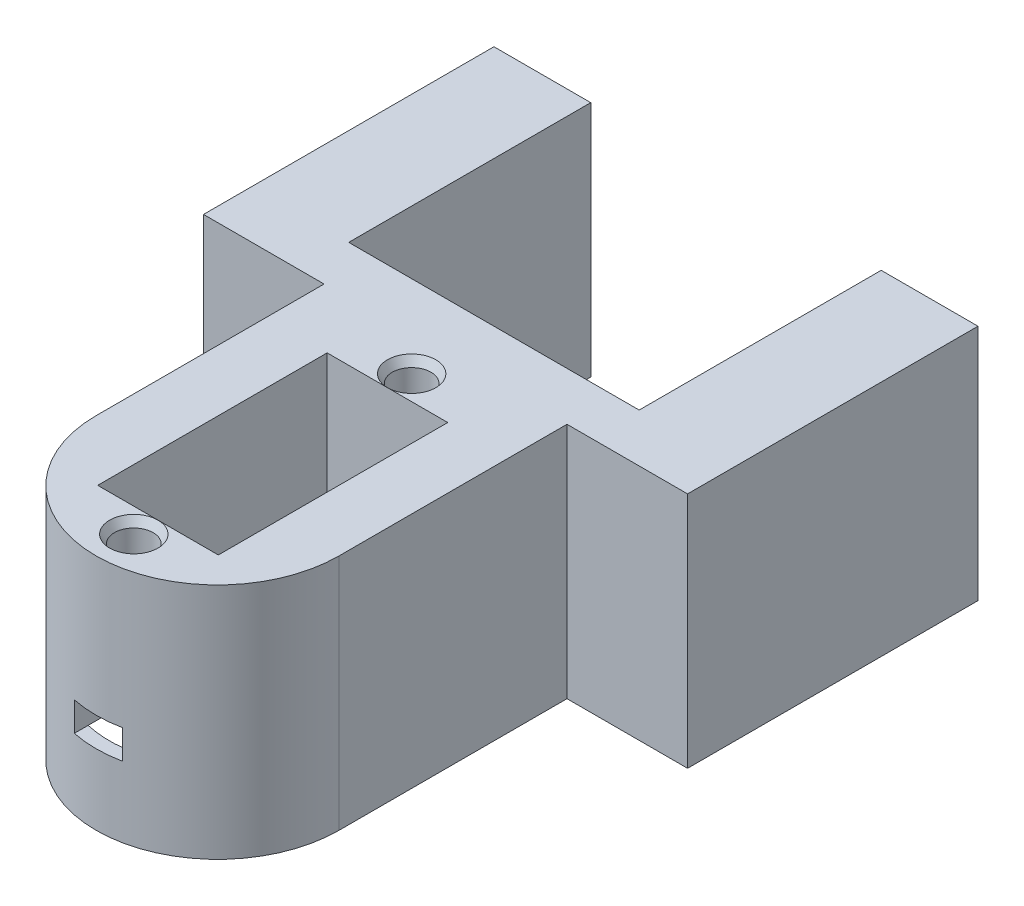
ISO-10303-21;
HEADER;
FILE_DESCRIPTION(('STEP AP214'),'2;1');
FILE_NAME('part.step','',(''),(''),'','','');
FILE_SCHEMA(('AUTOMOTIVE_DESIGN { 1 0 10303 214 1 1 1 1 }'));
ENDSEC;
DATA;
#1=APPLICATION_CONTEXT('core data for automotive mechanical design processes');
#2=APPLICATION_PROTOCOL_DEFINITION('international standard','automotive_design',2000,#1);
#3=PRODUCT_CONTEXT('',#1,'mechanical');
#4=PRODUCT('Part','Part','',(#3));
#5=PRODUCT_RELATED_PRODUCT_CATEGORY('part','',(#4));
#6=PRODUCT_DEFINITION_FORMATION('','',#4);
#7=PRODUCT_DEFINITION_CONTEXT('part definition',#1,'design');
#8=PRODUCT_DEFINITION('design','',#6,#7);
#9=PRODUCT_DEFINITION_SHAPE('','',#8);
#10=(LENGTH_UNIT() NAMED_UNIT(*) SI_UNIT(.MILLI.,.METRE.));
#11=(NAMED_UNIT(*) PLANE_ANGLE_UNIT() SI_UNIT($,.RADIAN.));
#12=(NAMED_UNIT(*) SI_UNIT($,.STERADIAN.) SOLID_ANGLE_UNIT());
#13=UNCERTAINTY_MEASURE_WITH_UNIT(LENGTH_MEASURE(1.E-05),#10,'distance_accuracy_value','');
#14=(GEOMETRIC_REPRESENTATION_CONTEXT(3) GLOBAL_UNCERTAINTY_ASSIGNED_CONTEXT((#13)) GLOBAL_UNIT_ASSIGNED_CONTEXT((#10,
#11,#12)) REPRESENTATION_CONTEXT('',''));
#15=CARTESIAN_POINT('',(0.,0.,0.));
#16=DIRECTION('',(0.,0.,1.));
#17=DIRECTION('',(1.,0.,0.));
#18=AXIS2_PLACEMENT_3D('',#15,#16,#17);
#19=CARTESIAN_POINT('',(-6.23,55.2500254806121,6.));
#20=DIRECTION('',(0.,1.,0.));
#21=DIRECTION('',(0.,0.,1.));
#22=AXIS2_PLACEMENT_3D('',#19,#20,#21);
#23=PLANE('',#22);
#24=DIRECTION('',(0.,0.,1.));
#25=VECTOR('',#24,1.);
#26=CARTESIAN_POINT('',(2.5,55.2500254806121,-0.001000000000001));
#27=LINE('',#26,#25);
#28=CARTESIAN_POINT('',(2.5,55.2500254806121,29.7));
#29=VERTEX_POINT('',#28);
#30=CARTESIAN_POINT('',(2.5,55.2500254806121,34.4161170617659));
#31=VERTEX_POINT('',#30);
#32=EDGE_CURVE('E300',#29,#31,#27,.T.);
#33=ORIENTED_EDGE('',*,*,#32,.F.);
#34=DIRECTION('',(1.,0.,0.));
#35=VECTOR('',#34,1.);
#36=CARTESIAN_POINT('',(-6.23,55.2500254806121,29.7));
#37=LINE('',#36,#35);
#38=CARTESIAN_POINT('',(6.23,55.2500254806121,29.7));
#39=VERTEX_POINT('',#38);
#40=EDGE_CURVE('E326',#29,#39,#37,.T.);
#41=ORIENTED_EDGE('',*,*,#40,.T.);
#42=DIRECTION('',(0.,0.,-1.));
#43=VECTOR('',#42,1.);
#44=CARTESIAN_POINT('',(6.23,55.2500254806121,29.7));
#45=LINE('',#44,#43);
#46=CARTESIAN_POINT('',(6.23,55.2500254806121,14.3028599015696));
#47=VERTEX_POINT('',#46);
#48=EDGE_CURVE('E321',#39,#47,#45,.T.);
#49=ORIENTED_EDGE('',*,*,#48,.T.);
#50=CARTESIAN_POINT('',(0.,55.2500254806121,23.55));
#51=DIRECTION('',(0.,1.,0.));
#52=DIRECTION('',(0.,0.,1.));
#53=AXIS2_PLACEMENT_3D('',#50,#51,#52);
#54=CIRCLE('',#53,11.15);
#55=EDGE_CURVE('E313',#31,#47,#54,.T.);
#56=ORIENTED_EDGE('',*,*,#55,.F.);
#57=EDGE_LOOP('',(#33,#41,#49,#56));
#58=FACE_BOUND('',#57,.T.);
#59=ADVANCED_FACE('F41',(#58),#23,.F.);
#60=CARTESIAN_POINT('',(-6.23,11.2879454134343,29.7));
#61=DIRECTION('',(0.,0.,-1.));
#62=DIRECTION('',(-1.,0.,0.));
#63=AXIS2_PLACEMENT_3D('',#60,#61,#62);
#64=PLANE('',#63);
#65=DIRECTION('',(-1.,0.,0.));
#66=VECTOR('',#65,1.);
#67=CARTESIAN_POINT('',(-2.5,58.2500254806121,29.7));
#68=LINE('',#67,#66);
#69=CARTESIAN_POINT('',(2.5,58.2500254806121,29.7));
#70=VERTEX_POINT('',#69);
#71=CARTESIAN_POINT('',(-2.5,58.2500254806121,29.7));
#72=VERTEX_POINT('',#71);
#73=EDGE_CURVE('E282',#70,#72,#68,.T.);
#74=ORIENTED_EDGE('',*,*,#73,.T.);
#75=DIRECTION('',(0.,-1.,0.));
#76=VECTOR('',#75,1.);
#77=CARTESIAN_POINT('',(-2.5,58.2500254806121,29.7));
#78=LINE('',#77,#76);
#79=CARTESIAN_POINT('',(-2.5,55.2500254806121,29.7));
#80=VERTEX_POINT('',#79);
#81=EDGE_CURVE('E290',#72,#80,#78,.T.);
#82=ORIENTED_EDGE('',*,*,#81,.T.);
#83=CARTESIAN_POINT('',(-6.23,55.2500254806121,29.7));
#84=VERTEX_POINT('',#83);
#85=EDGE_CURVE('E356',#84,#80,#37,.T.);
#86=ORIENTED_EDGE('',*,*,#85,.F.);
#87=DIRECTION('',(0.,1.,0.));
#88=VECTOR('',#87,1.);
#89=CARTESIAN_POINT('',(-6.23,11.2879454134343,29.7));
#90=LINE('',#89,#88);
#91=CARTESIAN_POINT('',(-6.23,72.5000254806121,29.7));
#92=VERTEX_POINT('',#91);
#93=EDGE_CURVE('E355',#84,#92,#90,.T.);
#94=ORIENTED_EDGE('',*,*,#93,.T.);
#95=DIRECTION('',(-1.,0.,0.));
#96=VECTOR('',#95,1.);
#97=CARTESIAN_POINT('',(-6.23,72.5000254806121,29.7));
#98=LINE('',#97,#96);
#99=CARTESIAN_POINT('',(0.,72.5000254806121,29.7));
#100=VERTEX_POINT('',#99);
#101=EDGE_CURVE('E328',#100,#92,#98,.T.);
#102=ORIENTED_EDGE('',*,*,#101,.F.);
#103=CARTESIAN_POINT('',(6.23,72.5000254806121,29.7));
#104=VERTEX_POINT('',#103);
#105=EDGE_CURVE('E327',#104,#100,#98,.T.);
#106=ORIENTED_EDGE('',*,*,#105,.F.);
#107=DIRECTION('',(0.,1.,0.));
#108=VECTOR('',#107,1.);
#109=CARTESIAN_POINT('',(6.23,11.2879454134343,29.7));
#110=LINE('',#109,#108);
#111=EDGE_CURVE('E341',#39,#104,#110,.T.);
#112=ORIENTED_EDGE('',*,*,#111,.F.);
#113=ORIENTED_EDGE('',*,*,#40,.F.);
#114=DIRECTION('',(0.,1.,0.));
#115=VECTOR('',#114,1.);
#116=CARTESIAN_POINT('',(2.5,58.2500254806121,29.7));
#117=LINE('',#116,#115);
#118=EDGE_CURVE('E281',#29,#70,#117,.T.);
#119=ORIENTED_EDGE('',*,*,#118,.T.);
#120=EDGE_LOOP('',(#74,#82,#86,#94,#102,#106,#112,#113,#119));
#121=FACE_BOUND('',#120,.T.);
#122=ADVANCED_FACE('F405',(#121),#64,.T.);
#123=CARTESIAN_POINT('',(-6.23,72.5000254806121,6.));
#124=DIRECTION('',(0.,-1.,0.));
#125=DIRECTION('',(0.,0.,-1.));
#126=AXIS2_PLACEMENT_3D('',#123,#124,#125);
#127=PLANE('',#126);
#128=DIRECTION('',(0.,0.,1.));
#129=VECTOR('',#128,1.);
#130=CARTESIAN_POINT('',(-12.5467811820916,72.5000254806121,23.55));
#131=LINE('',#130,#129);
#132=CARTESIAN_POINT('',(-12.5467811820916,72.5000254806121,0.));
#133=VERTEX_POINT('',#132);
#134=CARTESIAN_POINT('',(-12.5467811820916,72.5000254806121,23.55));
#135=VERTEX_POINT('',#134);
#136=EDGE_CURVE('E332',#133,#135,#131,.T.);
#137=ORIENTED_EDGE('',*,*,#136,.T.);
#138=CARTESIAN_POINT('',(0.,72.5000254806121,23.55));
#139=DIRECTION('',(0.,1.,0.));
#140=DIRECTION('',(0.,0.,1.));
#141=AXIS2_PLACEMENT_3D('',#138,#139,#140);
#142=CIRCLE('',#141,12.5467811820916);
#143=CARTESIAN_POINT('',(12.5467811820916,72.5000254806121,23.55));
#144=VERTEX_POINT('',#143);
#145=EDGE_CURVE('E336',#135,#144,#142,.T.);
#146=ORIENTED_EDGE('',*,*,#145,.T.);
#147=DIRECTION('',(0.,0.,-1.));
#148=VECTOR('',#147,1.);
#149=CARTESIAN_POINT('',(12.5467811820916,72.5000254806121,23.55));
#150=LINE('',#149,#148);
#151=CARTESIAN_POINT('',(12.5467811820916,72.5000254806121,0.));
#152=VERTEX_POINT('',#151);
#153=EDGE_CURVE('E342',#144,#152,#150,.T.);
#154=ORIENTED_EDGE('',*,*,#153,.T.);
#155=DIRECTION('',(1.,0.,0.));
#156=VECTOR('',#155,1.);
#157=CARTESIAN_POINT('',(-25.,72.5000254806121,0.));
#158=LINE('',#157,#156);
#159=CARTESIAN_POINT('',(25.,72.5000254806121,0.));
#160=VERTEX_POINT('',#159);
#161=EDGE_CURVE('E488',#152,#160,#158,.T.);
#162=ORIENTED_EDGE('',*,*,#161,.T.);
#163=DIRECTION('',(0.,0.,-1.));
#164=VECTOR('',#163,1.);
#165=CARTESIAN_POINT('',(25.,72.5000254806121,-30.));
#166=LINE('',#165,#164);
#167=CARTESIAN_POINT('',(25.,72.5000254806121,-30.));
#168=VERTEX_POINT('',#167);
#169=EDGE_CURVE('E490',#160,#168,#166,.T.);
#170=ORIENTED_EDGE('',*,*,#169,.T.);
#171=DIRECTION('',(-1.,0.,0.));
#172=VECTOR('',#171,1.);
#173=CARTESIAN_POINT('',(15.,72.5000254806121,-30.));
#174=LINE('',#173,#172);
#175=CARTESIAN_POINT('',(15.,72.5000254806121,-30.));
#176=VERTEX_POINT('',#175);
#177=EDGE_CURVE('E220',#168,#176,#174,.T.);
#178=ORIENTED_EDGE('',*,*,#177,.T.);
#179=DIRECTION('',(0.,0.,1.));
#180=VECTOR('',#179,1.);
#181=CARTESIAN_POINT('',(15.,72.5000254806121,-5.));
#182=LINE('',#181,#180);
#183=CARTESIAN_POINT('',(15.,72.5000254806121,-5.));
#184=VERTEX_POINT('',#183);
#185=EDGE_CURVE('E489',#176,#184,#182,.T.);
#186=ORIENTED_EDGE('',*,*,#185,.T.);
#187=DIRECTION('',(-1.,0.,0.));
#188=VECTOR('',#187,1.);
#189=CARTESIAN_POINT('',(-15.,72.5000254806121,-5.));
#190=LINE('',#189,#188);
#191=CARTESIAN_POINT('',(-15.,72.5000254806121,-5.));
#192=VERTEX_POINT('',#191);
#193=EDGE_CURVE('E492',#184,#192,#190,.T.);
#194=ORIENTED_EDGE('',*,*,#193,.T.);
#195=DIRECTION('',(0.,0.,-1.));
#196=VECTOR('',#195,1.);
#197=CARTESIAN_POINT('',(-15.,72.5000254806121,-30.));
#198=LINE('',#197,#196);
#199=CARTESIAN_POINT('',(-15.,72.5000254806121,-30.));
#200=VERTEX_POINT('',#199);
#201=EDGE_CURVE('E498',#192,#200,#198,.T.);
#202=ORIENTED_EDGE('',*,*,#201,.T.);
#203=DIRECTION('',(-1.,0.,0.));
#204=VECTOR('',#203,1.);
#205=CARTESIAN_POINT('',(-25.,72.5000254806121,-30.));
#206=LINE('',#205,#204);
#207=CARTESIAN_POINT('',(-25.,72.5000254806121,-30.));
#208=VERTEX_POINT('',#207);
#209=EDGE_CURVE('E230',#200,#208,#206,.T.);
#210=ORIENTED_EDGE('',*,*,#209,.T.);
#211=DIRECTION('',(0.,0.,1.));
#212=VECTOR('',#211,1.);
#213=CARTESIAN_POINT('',(-25.,72.5000254806121,0.));
#214=LINE('',#213,#212);
#215=CARTESIAN_POINT('',(-25.,72.5000254806121,0.));
#216=VERTEX_POINT('',#215);
#217=EDGE_CURVE('E228',#208,#216,#214,.T.);
#218=ORIENTED_EDGE('',*,*,#217,.T.);
#219=EDGE_CURVE('E231',#216,#133,#158,.T.);
#220=ORIENTED_EDGE('',*,*,#219,.T.);
#221=EDGE_LOOP('',(#137,#146,#154,#162,#170,#178,#186,#194,#202,#210,#218,#220));
#222=FACE_BOUND('',#221,.T.);
#223=DIRECTION('',(0.,0.,-1.));
#224=VECTOR('',#223,1.);
#225=CARTESIAN_POINT('',(-6.23,72.5000254806121,0.));
#226=LINE('',#225,#224);
#227=CARTESIAN_POINT('',(-6.23,72.5000254806121,6.));
#228=VERTEX_POINT('',#227);
#229=EDGE_CURVE('E335',#92,#228,#226,.T.);
#230=ORIENTED_EDGE('',*,*,#229,.T.);
#231=DIRECTION('',(-1.,0.,0.));
#232=VECTOR('',#231,1.);
#233=CARTESIAN_POINT('',(-6.23,72.5000254806121,6.));
#234=LINE('',#233,#232);
#235=CARTESIAN_POINT('',(0.,72.5000254806121,6.));
#236=VERTEX_POINT('',#235);
#237=EDGE_CURVE('E369',#236,#228,#234,.T.);
#238=ORIENTED_EDGE('',*,*,#237,.F.);
#239=CARTESIAN_POINT('',(0.,72.5000254806121,3.5));
#240=DIRECTION('',(0.,-1.,0.));
#241=DIRECTION('',(0.,0.,-1.));
#242=AXIS2_PLACEMENT_3D('',#239,#240,#241);
#243=CIRCLE('',#242,2.49999999999999);
#244=EDGE_CURVE('E380',#236,#236,#243,.T.);
#245=ORIENTED_EDGE('',*,*,#244,.T.);
#246=CARTESIAN_POINT('',(6.23,72.5000254806121,6.));
#247=VERTEX_POINT('',#246);
#248=EDGE_CURVE('E371',#247,#236,#234,.T.);
#249=ORIENTED_EDGE('',*,*,#248,.F.);
#250=DIRECTION('',(0.,0.,1.));
#251=VECTOR('',#250,1.);
#252=CARTESIAN_POINT('',(6.23,72.5000254806121,29.7));
#253=LINE('',#252,#251);
#254=EDGE_CURVE('E319',#247,#104,#253,.T.);
#255=ORIENTED_EDGE('',*,*,#254,.T.);
#256=ORIENTED_EDGE('',*,*,#105,.T.);
#257=CARTESIAN_POINT('',(0.,72.5000254806121,32.2));
#258=DIRECTION('',(0.,-1.,0.));
#259=DIRECTION('',(0.,0.,-1.));
#260=AXIS2_PLACEMENT_3D('',#257,#258,#259);
#261=CIRCLE('',#260,2.5);
#262=EDGE_CURVE('E379',#100,#100,#261,.T.);
#263=ORIENTED_EDGE('',*,*,#262,.T.);
#264=ORIENTED_EDGE('',*,*,#101,.T.);
#265=EDGE_LOOP('',(#230,#238,#245,#249,#255,#256,#263,#264));
#266=FACE_BOUND('',#265,.T.);
#267=ADVANCED_FACE('F406',(#222,#266),#127,.F.);
#268=CARTESIAN_POINT('',(0.,11.2879454134343,23.55));
#269=DIRECTION('',(0.,1.,0.));
#270=DIRECTION('',(0.,0.,1.));
#271=AXIS2_PLACEMENT_3D('',#268,#269,#270);
#272=CYLINDRICAL_SURFACE('',#271,12.5467811820916);
#273=CARTESIAN_POINT('',(0.,47.9500254806121,23.55));
#274=DIRECTION('',(0.,-1.,0.));
#275=DIRECTION('',(0.,0.,-1.));
#276=AXIS2_PLACEMENT_3D('',#273,#274,#275);
#277=CIRCLE('',#276,12.5467811820916);
#278=CARTESIAN_POINT('',(12.5467811820916,47.9500254806121,23.55));
#279=VERTEX_POINT('',#278);
#280=CARTESIAN_POINT('',(-12.5467811820916,47.9500254806121,23.55));
#281=VERTEX_POINT('',#280);
#282=EDGE_CURVE('E315',#279,#281,#277,.T.);
#283=ORIENTED_EDGE('',*,*,#282,.F.);
#284=DIRECTION('',(0.,1.,0.));
#285=VECTOR('',#284,1.);
#286=CARTESIAN_POINT('',(12.5467811820916,11.2879454134343,23.55));
#287=LINE('',#286,#285);
#288=EDGE_CURVE('E346',#279,#144,#287,.T.);
#289=ORIENTED_EDGE('',*,*,#288,.T.);
#290=ORIENTED_EDGE('',*,*,#145,.F.);
#291=DIRECTION('',(0.,1.,0.));
#292=VECTOR('',#291,1.);
#293=CARTESIAN_POINT('',(-12.5467811820916,11.2879454134343,23.55));
#294=LINE('',#293,#292);
#295=EDGE_CURVE('E60',#281,#135,#294,.T.);
#296=ORIENTED_EDGE('',*,*,#295,.F.);
#297=EDGE_LOOP('',(#283,#289,#290,#296));
#298=FACE_BOUND('',#297,.T.);
#299=CARTESIAN_POINT('',(0.,55.2500254806121,23.55));
#300=DIRECTION('',(0.,-1.,0.));
#301=DIRECTION('',(0.,0.,-1.));
#302=AXIS2_PLACEMENT_3D('',#299,#300,#301);
#303=CIRCLE('',#302,12.5467811820916);
#304=CARTESIAN_POINT('',(2.5,55.2500254806121,35.8451908497302));
#305=VERTEX_POINT('',#304);
#306=CARTESIAN_POINT('',(-2.5,55.2500254806121,35.8451908497302));
#307=VERTEX_POINT('',#306);
#308=EDGE_CURVE('E272',#305,#307,#303,.T.);
#309=ORIENTED_EDGE('',*,*,#308,.T.);
#310=DIRECTION('',(0.,1.,0.));
#311=VECTOR('',#310,1.);
#312=CARTESIAN_POINT('',(-2.5,11.2879454134343,35.8451908497302));
#313=LINE('',#312,#311);
#314=CARTESIAN_POINT('',(-2.5,58.2500254806121,35.8451908497302));
#315=VERTEX_POINT('',#314);
#316=EDGE_CURVE('E273',#307,#315,#313,.T.);
#317=ORIENTED_EDGE('',*,*,#316,.T.);
#318=CARTESIAN_POINT('',(0.,58.2500254806121,23.55));
#319=DIRECTION('',(0.,1.,0.));
#320=DIRECTION('',(0.,0.,1.));
#321=AXIS2_PLACEMENT_3D('',#318,#319,#320);
#322=CIRCLE('',#321,12.5467811820916);
#323=CARTESIAN_POINT('',(2.5,58.2500254806121,35.8451908497302));
#324=VERTEX_POINT('',#323);
#325=EDGE_CURVE('E270',#315,#324,#322,.T.);
#326=ORIENTED_EDGE('',*,*,#325,.T.);
#327=DIRECTION('',(0.,1.,0.));
#328=VECTOR('',#327,1.);
#329=CARTESIAN_POINT('',(2.5,11.2879454134343,35.8451908497302));
#330=LINE('',#329,#328);
#331=EDGE_CURVE('E274',#324,#305,#330,.F.);
#332=ORIENTED_EDGE('',*,*,#331,.T.);
#333=EDGE_LOOP('',(#309,#317,#326,#332));
#334=FACE_BOUND('',#333,.T.);
#335=ADVANCED_FACE('F428',(#298,#334),#272,.T.);
#336=CARTESIAN_POINT('',(0.,107.987681704295,23.55));
#337=DIRECTION('',(0.,-1.,0.));
#338=DIRECTION('',(0.,0.,-1.));
#339=AXIS2_PLACEMENT_3D('',#336,#337,#338);
#340=CYLINDRICAL_SURFACE('',#339,11.15);
#341=CARTESIAN_POINT('',(0.,47.9500254806121,23.55));
#342=DIRECTION('',(0.,-1.,0.));
#343=DIRECTION('',(0.,0.,-1.));
#344=AXIS2_PLACEMENT_3D('',#341,#342,#343);
#345=CIRCLE('',#344,11.15);
#346=CARTESIAN_POINT('',(0.,47.9500254806121,12.4));
#347=VERTEX_POINT('',#346);
#348=EDGE_CURVE('E310',#347,#347,#345,.T.);
#349=ORIENTED_EDGE('',*,*,#348,.T.);
#350=EDGE_LOOP('',(#349));
#351=FACE_BOUND('',#350,.T.);
#352=CARTESIAN_POINT('',(0.,55.2500254806121,23.55));
#353=DIRECTION('',(0.,1.,0.));
#354=DIRECTION('',(0.,0.,1.));
#355=AXIS2_PLACEMENT_3D('',#352,#353,#354);
#356=CIRCLE('',#355,11.15);
#357=CARTESIAN_POINT('',(-6.23,55.2500254806121,14.3028599015696));
#358=VERTEX_POINT('',#357);
#359=EDGE_CURVE('E11',#358,#47,#356,.F.);
#360=ORIENTED_EDGE('',*,*,#359,.F.);
#361=CARTESIAN_POINT('',(-2.5,55.2500254806121,34.4161170617659));
#362=VERTEX_POINT('',#361);
#363=EDGE_CURVE('E314',#358,#362,#54,.T.);
#364=ORIENTED_EDGE('',*,*,#363,.T.);
#365=EDGE_CURVE('E316',#362,#31,#54,.T.);
#366=ORIENTED_EDGE('',*,*,#365,.T.);
#367=ORIENTED_EDGE('',*,*,#55,.T.);
#368=EDGE_LOOP('',(#360,#364,#366,#367));
#369=FACE_BOUND('',#368,.T.);
#370=ADVANCED_FACE('F419',(#351,#369),#340,.F.);
#371=ORIENTED_EDGE('',*,*,#85,.T.);
#372=DIRECTION('',(0.,0.,1.));
#373=VECTOR('',#372,1.);
#374=CARTESIAN_POINT('',(-2.5,55.2500254806121,-0.001000000000001));
#375=LINE('',#374,#373);
#376=EDGE_CURVE('E301',#80,#362,#375,.T.);
#377=ORIENTED_EDGE('',*,*,#376,.T.);
#378=ORIENTED_EDGE('',*,*,#363,.F.);
#379=DIRECTION('',(0.,0.,1.));
#380=VECTOR('',#379,1.);
#381=CARTESIAN_POINT('',(-6.23,55.2500254806121,0.));
#382=LINE('',#381,#380);
#383=EDGE_CURVE('E325',#358,#84,#382,.T.);
#384=ORIENTED_EDGE('',*,*,#383,.T.);
#385=EDGE_LOOP('',(#371,#377,#378,#384));
#386=FACE_BOUND('',#385,.T.);
#387=ADVANCED_FACE('F403',(#386),#23,.F.);
#388=CARTESIAN_POINT('',(0.,0.,6.));
#389=DIRECTION('',(0.,0.,-1.));
#390=DIRECTION('',(-1.,0.,0.));
#391=AXIS2_PLACEMENT_3D('',#388,#389,#390);
#392=PLANE('',#391);
#393=DIRECTION('',(0.,-1.,0.));
#394=VECTOR('',#393,1.);
#395=CARTESIAN_POINT('',(-6.23,55.2500254806121,6.));
#396=LINE('',#395,#394);
#397=CARTESIAN_POINT('',(-6.23,55.2500254806121,6.));
#398=VERTEX_POINT('',#397);
#399=EDGE_CURVE('E363',#228,#398,#396,.T.);
#400=ORIENTED_EDGE('',*,*,#399,.T.);
#401=DIRECTION('',(1.,0.,0.));
#402=VECTOR('',#401,1.);
#403=CARTESIAN_POINT('',(-6.23,55.2500254806121,6.));
#404=LINE('',#403,#402);
#405=CARTESIAN_POINT('',(6.23,55.2500254806121,6.));
#406=VERTEX_POINT('',#405);
#407=EDGE_CURVE('E364',#398,#406,#404,.T.);
#408=ORIENTED_EDGE('',*,*,#407,.T.);
#409=DIRECTION('',(0.,1.,0.));
#410=VECTOR('',#409,1.);
#411=CARTESIAN_POINT('',(6.23,55.2500254806121,6.));
#412=LINE('',#411,#410);
#413=EDGE_CURVE('E370',#406,#247,#412,.T.);
#414=ORIENTED_EDGE('',*,*,#413,.T.);
#415=ORIENTED_EDGE('',*,*,#248,.T.);
#416=ORIENTED_EDGE('',*,*,#237,.T.);
#417=EDGE_LOOP('',(#400,#408,#414,#415,#416));
#418=FACE_BOUND('',#417,.T.);
#419=ADVANCED_FACE('F412',(#418),#392,.F.);
#420=CARTESIAN_POINT('',(-6.23,11.2879454134343,0.));
#421=DIRECTION('',(1.,0.,0.));
#422=DIRECTION('',(0.,0.,-1.));
#423=AXIS2_PLACEMENT_3D('',#420,#421,#422);
#424=PLANE('',#423);
#425=ORIENTED_EDGE('',*,*,#399,.F.);
#426=ORIENTED_EDGE('',*,*,#229,.F.);
#427=ORIENTED_EDGE('',*,*,#93,.F.);
#428=ORIENTED_EDGE('',*,*,#383,.F.);
#429=EDGE_CURVE('E318',#398,#358,#382,.T.);
#430=ORIENTED_EDGE('',*,*,#429,.F.);
#431=EDGE_LOOP('',(#425,#426,#427,#428,#430));
#432=FACE_BOUND('',#431,.T.);
#433=ADVANCED_FACE('F421',(#432),#424,.T.);
#434=CARTESIAN_POINT('',(6.23,11.2879454134343,29.7));
#435=DIRECTION('',(-1.,0.,0.));
#436=DIRECTION('',(0.,0.,1.));
#437=AXIS2_PLACEMENT_3D('',#434,#435,#436);
#438=PLANE('',#437);
#439=EDGE_CURVE('E324',#47,#406,#45,.T.);
#440=ORIENTED_EDGE('',*,*,#439,.F.);
#441=ORIENTED_EDGE('',*,*,#48,.F.);
#442=ORIENTED_EDGE('',*,*,#111,.T.);
#443=ORIENTED_EDGE('',*,*,#254,.F.);
#444=ORIENTED_EDGE('',*,*,#413,.F.);
#445=EDGE_LOOP('',(#440,#441,#442,#443,#444));
#446=FACE_BOUND('',#445,.T.);
#447=ADVANCED_FACE('F448',(#446),#438,.T.);
#448=CARTESIAN_POINT('',(12.5467811820916,11.2879454134343,23.55));
#449=DIRECTION('',(1.,0.,0.));
#450=DIRECTION('',(0.,0.,-1.));
#451=AXIS2_PLACEMENT_3D('',#448,#449,#450);
#452=PLANE('',#451);
#453=ORIENTED_EDGE('',*,*,#288,.F.);
#454=DIRECTION('',(0.,0.,1.));
#455=VECTOR('',#454,1.);
#456=CARTESIAN_POINT('',(12.5467811820916,47.9500254806121,0.));
#457=LINE('',#456,#455);
#458=CARTESIAN_POINT('',(12.5467811820916,47.9500254806121,0.));
#459=VERTEX_POINT('',#458);
#460=EDGE_CURVE('E262',#459,#279,#457,.T.);
#461=ORIENTED_EDGE('',*,*,#460,.F.);
#462=DIRECTION('',(0.,1.,0.));
#463=VECTOR('',#462,1.);
#464=CARTESIAN_POINT('',(12.5467811820916,11.2879454134343,0.));
#465=LINE('',#464,#463);
#466=EDGE_CURVE('E343',#459,#152,#465,.T.);
#467=ORIENTED_EDGE('',*,*,#466,.T.);
#468=ORIENTED_EDGE('',*,*,#153,.F.);
#469=EDGE_LOOP('',(#453,#461,#467,#468));
#470=FACE_BOUND('',#469,.T.);
#471=ADVANCED_FACE('F465',(#470),#452,.T.);
#472=CARTESIAN_POINT('',(-12.5467811820916,11.2879454134343,23.55));
#473=DIRECTION('',(-1.,0.,0.));
#474=DIRECTION('',(0.,0.,1.));
#475=AXIS2_PLACEMENT_3D('',#472,#473,#474);
#476=PLANE('',#475);
#477=DIRECTION('',(0.,1.,0.));
#478=VECTOR('',#477,1.);
#479=CARTESIAN_POINT('',(-12.5467811820916,11.2879454134343,0.));
#480=LINE('',#479,#478);
#481=CARTESIAN_POINT('',(-12.5467811820916,47.9500254806121,0.));
#482=VERTEX_POINT('',#481);
#483=EDGE_CURVE('E347',#482,#133,#480,.T.);
#484=ORIENTED_EDGE('',*,*,#483,.F.);
#485=DIRECTION('',(0.,0.,-1.));
#486=VECTOR('',#485,1.);
#487=CARTESIAN_POINT('',(-12.5467811820916,47.9500254806121,23.55));
#488=LINE('',#487,#486);
#489=EDGE_CURVE('E263',#281,#482,#488,.T.);
#490=ORIENTED_EDGE('',*,*,#489,.F.);
#491=ORIENTED_EDGE('',*,*,#295,.T.);
#492=ORIENTED_EDGE('',*,*,#136,.F.);
#493=EDGE_LOOP('',(#484,#490,#491,#492));
#494=FACE_BOUND('',#493,.T.);
#495=ADVANCED_FACE('F467',(#494),#476,.T.);
#496=CARTESIAN_POINT('',(0.,47.9500254806121,23.55));
#497=DIRECTION('',(0.,-1.,0.));
#498=DIRECTION('',(0.,0.,-1.));
#499=AXIS2_PLACEMENT_3D('',#496,#497,#498);
#500=PLANE('',#499);
#501=ORIENTED_EDGE('',*,*,#282,.T.);
#502=ORIENTED_EDGE('',*,*,#489,.T.);
#503=DIRECTION('',(1.,0.,0.));
#504=VECTOR('',#503,1.);
#505=CARTESIAN_POINT('',(-25.,47.9500254806121,0.));
#506=LINE('',#505,#504);
#507=CARTESIAN_POINT('',(-25.,47.9500254806121,0.));
#508=VERTEX_POINT('',#507);
#509=EDGE_CURVE('E232',#508,#482,#506,.T.);
#510=ORIENTED_EDGE('',*,*,#509,.F.);
#511=DIRECTION('',(0.,0.,1.));
#512=VECTOR('',#511,1.);
#513=CARTESIAN_POINT('',(-25.,47.9500254806121,0.));
#514=LINE('',#513,#512);
#515=CARTESIAN_POINT('',(-25.,47.9500254806121,-30.));
#516=VERTEX_POINT('',#515);
#517=EDGE_CURVE('E237',#516,#508,#514,.T.);
#518=ORIENTED_EDGE('',*,*,#517,.F.);
#519=DIRECTION('',(-1.,0.,0.));
#520=VECTOR('',#519,1.);
#521=CARTESIAN_POINT('',(-25.,47.9500254806121,-30.));
#522=LINE('',#521,#520);
#523=CARTESIAN_POINT('',(-15.,47.9500254806121,-30.));
#524=VERTEX_POINT('',#523);
#525=EDGE_CURVE('E242',#524,#516,#522,.T.);
#526=ORIENTED_EDGE('',*,*,#525,.F.);
#527=DIRECTION('',(0.,0.,-1.));
#528=VECTOR('',#527,1.);
#529=CARTESIAN_POINT('',(-15.,47.9500254806121,-30.));
#530=LINE('',#529,#528);
#531=CARTESIAN_POINT('',(-15.,47.9500254806121,-5.));
#532=VERTEX_POINT('',#531);
#533=EDGE_CURVE('E247',#532,#524,#530,.T.);
#534=ORIENTED_EDGE('',*,*,#533,.F.);
#535=DIRECTION('',(-1.,0.,0.));
#536=VECTOR('',#535,1.);
#537=CARTESIAN_POINT('',(-15.,47.9500254806121,-5.));
#538=LINE('',#537,#536);
#539=CARTESIAN_POINT('',(15.,47.9500254806121,-5.));
#540=VERTEX_POINT('',#539);
#541=EDGE_CURVE('E255',#540,#532,#538,.T.);
#542=ORIENTED_EDGE('',*,*,#541,.F.);
#543=DIRECTION('',(0.,0.,1.));
#544=VECTOR('',#543,1.);
#545=CARTESIAN_POINT('',(15.,47.9500254806121,-5.));
#546=LINE('',#545,#544);
#547=CARTESIAN_POINT('',(15.,47.9500254806121,-30.));
#548=VERTEX_POINT('',#547);
#549=EDGE_CURVE('E209',#548,#540,#546,.T.);
#550=ORIENTED_EDGE('',*,*,#549,.F.);
#551=DIRECTION('',(-1.,0.,0.));
#552=VECTOR('',#551,1.);
#553=CARTESIAN_POINT('',(15.,47.9500254806121,-30.));
#554=LINE('',#553,#552);
#555=CARTESIAN_POINT('',(25.,47.9500254806121,-30.));
#556=VERTEX_POINT('',#555);
#557=EDGE_CURVE('E198',#556,#548,#554,.T.);
#558=ORIENTED_EDGE('',*,*,#557,.F.);
#559=DIRECTION('',(0.,0.,-1.));
#560=VECTOR('',#559,1.);
#561=CARTESIAN_POINT('',(25.,47.9500254806121,-30.));
#562=LINE('',#561,#560);
#563=CARTESIAN_POINT('',(25.,47.9500254806121,0.));
#564=VERTEX_POINT('',#563);
#565=EDGE_CURVE('E207',#564,#556,#562,.T.);
#566=ORIENTED_EDGE('',*,*,#565,.F.);
#567=EDGE_CURVE('E238',#459,#564,#506,.T.);
#568=ORIENTED_EDGE('',*,*,#567,.F.);
#569=ORIENTED_EDGE('',*,*,#460,.T.);
#570=EDGE_LOOP('',(#501,#502,#510,#518,#526,#534,#542,#550,#558,#566,#568,#569));
#571=FACE_BOUND('',#570,.T.);
#572=ORIENTED_EDGE('',*,*,#348,.F.);
#573=EDGE_LOOP('',(#572));
#574=FACE_BOUND('',#573,.T.);
#575=ADVANCED_FACE('F201',(#571,#574),#500,.T.);
#576=CARTESIAN_POINT('',(0.,67.5000254806121,32.2));
#577=DIRECTION('',(0.,1.,0.));
#578=DIRECTION('',(0.,0.,1.));
#579=AXIS2_PLACEMENT_3D('',#576,#577,#578);
#580=CYLINDRICAL_SURFACE('',#579,2.);
#581=CARTESIAN_POINT('',(0.,71.6340000768277,32.2));
#582=DIRECTION('',(0.,-1.,0.));
#583=DIRECTION('',(0.,0.,-1.));
#584=AXIS2_PLACEMENT_3D('',#581,#582,#583);
#585=CIRCLE('',#584,2.);
#586=CARTESIAN_POINT('',(0.,71.6340000768277,30.2));
#587=VERTEX_POINT('',#586);
#588=EDGE_CURVE('E372',#587,#587,#585,.F.);
#589=ORIENTED_EDGE('',*,*,#588,.T.);
#590=EDGE_LOOP('',(#589));
#591=FACE_BOUND('',#590,.T.);
#592=CARTESIAN_POINT('',(0.,67.5000254806121,32.2));
#593=DIRECTION('',(0.,1.,0.));
#594=DIRECTION('',(0.,0.,1.));
#595=AXIS2_PLACEMENT_3D('',#592,#593,#594);
#596=CIRCLE('',#595,2.);
#597=CARTESIAN_POINT('',(0.,67.5000254806121,34.2));
#598=VERTEX_POINT('',#597);
#599=EDGE_CURVE('E291',#598,#598,#596,.T.);
#600=ORIENTED_EDGE('',*,*,#599,.F.);
#601=EDGE_LOOP('',(#600));
#602=FACE_BOUND('',#601,.T.);
#603=ADVANCED_FACE('F548',(#591,#602),#580,.F.);
#604=CARTESIAN_POINT('',(0.,67.5000254806121,32.2));
#605=DIRECTION('',(0.,1.,0.));
#606=DIRECTION('',(0.,0.,1.));
#607=AXIS2_PLACEMENT_3D('',#604,#605,#606);
#608=PLANE('',#607);
#609=ORIENTED_EDGE('',*,*,#599,.T.);
#610=EDGE_LOOP('',(#609));
#611=FACE_BOUND('',#610,.T.);
#612=ADVANCED_FACE('F550',(#611),#608,.T.);
#613=CARTESIAN_POINT('',(0.,67.5000254806121,3.5));
#614=DIRECTION('',(0.,1.,0.));
#615=DIRECTION('',(0.,0.,1.));
#616=AXIS2_PLACEMENT_3D('',#613,#614,#615);
#617=CYLINDRICAL_SURFACE('',#616,2.);
#618=CARTESIAN_POINT('',(0.,71.6340000768277,3.5));
#619=DIRECTION('',(0.,-1.,0.));
#620=DIRECTION('',(0.,0.,-1.));
#621=AXIS2_PLACEMENT_3D('',#618,#619,#620);
#622=CIRCLE('',#621,2.);
#623=CARTESIAN_POINT('',(0.,71.6340000768277,1.5));
#624=VERTEX_POINT('',#623);
#625=EDGE_CURVE('E49',#624,#624,#622,.F.);
#626=ORIENTED_EDGE('',*,*,#625,.T.);
#627=EDGE_LOOP('',(#626));
#628=FACE_BOUND('',#627,.T.);
#629=CARTESIAN_POINT('',(0.,67.5000254806121,3.5));
#630=DIRECTION('',(0.,1.,0.));
#631=DIRECTION('',(0.,0.,1.));
#632=AXIS2_PLACEMENT_3D('',#629,#630,#631);
#633=CIRCLE('',#632,2.);
#634=CARTESIAN_POINT('',(0.,67.5000254806121,5.5));
#635=VERTEX_POINT('',#634);
#636=EDGE_CURVE('E302',#635,#635,#633,.T.);
#637=ORIENTED_EDGE('',*,*,#636,.F.);
#638=EDGE_LOOP('',(#637));
#639=FACE_BOUND('',#638,.T.);
#640=ADVANCED_FACE('F383',(#628,#639),#617,.F.);
#641=CARTESIAN_POINT('',(0.,67.5000254806121,3.5));
#642=DIRECTION('',(0.,1.,0.));
#643=DIRECTION('',(0.,0.,1.));
#644=AXIS2_PLACEMENT_3D('',#641,#642,#643);
#645=PLANE('',#644);
#646=ORIENTED_EDGE('',*,*,#636,.T.);
#647=EDGE_LOOP('',(#646));
#648=FACE_BOUND('',#647,.T.);
#649=ADVANCED_FACE('F397',(#648),#645,.T.);
#650=CARTESIAN_POINT('',(0.,71.6340000768277,32.2));
#651=DIRECTION('',(0.,1.,0.));
#652=DIRECTION('',(0.,0.,1.));
#653=AXIS2_PLACEMENT_3D('',#650,#651,#652);
#654=CONICAL_SURFACE('',#653,2.,0.52359877559829);
#655=ORIENTED_EDGE('',*,*,#262,.F.);
#656=EDGE_LOOP('',(#655));
#657=FACE_BOUND('',#656,.T.);
#658=ORIENTED_EDGE('',*,*,#588,.F.);
#659=EDGE_LOOP('',(#658));
#660=FACE_BOUND('',#659,.T.);
#661=ADVANCED_FACE('F388',(#657,#660),#654,.F.);
#662=CARTESIAN_POINT('',(0.,71.6340000768277,3.5));
#663=DIRECTION('',(0.,1.,0.));
#664=DIRECTION('',(0.,0.,1.));
#665=AXIS2_PLACEMENT_3D('',#662,#663,#664);
#666=CONICAL_SURFACE('',#665,2.,0.523598775598293);
#667=ORIENTED_EDGE('',*,*,#244,.F.);
#668=EDGE_LOOP('',(#667));
#669=FACE_BOUND('',#668,.T.);
#670=ORIENTED_EDGE('',*,*,#625,.F.);
#671=EDGE_LOOP('',(#670));
#672=FACE_BOUND('',#671,.T.);
#673=ADVANCED_FACE('F42',(#669,#672),#666,.F.);
#674=CARTESIAN_POINT('',(-6.23,55.2500254806121,6.));
#675=DIRECTION('',(0.,1.,0.));
#676=DIRECTION('',(0.,0.,1.));
#677=AXIS2_PLACEMENT_3D('',#674,#675,#676);
#678=PLANE('',#677);
#679=ORIENTED_EDGE('',*,*,#429,.T.);
#680=ORIENTED_EDGE('',*,*,#359,.T.);
#681=ORIENTED_EDGE('',*,*,#439,.T.);
#682=ORIENTED_EDGE('',*,*,#407,.F.);
#683=EDGE_LOOP('',(#679,#680,#681,#682));
#684=FACE_BOUND('',#683,.T.);
#685=ADVANCED_FACE('F386',(#684),#678,.T.);
#686=CARTESIAN_POINT('',(-2.5,55.2500254806121,-0.001000000000001));
#687=DIRECTION('',(0.,-1.,0.));
#688=DIRECTION('',(0.,0.,-1.));
#689=AXIS2_PLACEMENT_3D('',#686,#687,#688);
#690=PLANE('',#689);
#691=EDGE_CURVE('E293',#362,#307,#375,.T.);
#692=ORIENTED_EDGE('',*,*,#691,.T.);
#693=ORIENTED_EDGE('',*,*,#308,.F.);
#694=EDGE_CURVE('E297',#31,#305,#27,.T.);
#695=ORIENTED_EDGE('',*,*,#694,.F.);
#696=ORIENTED_EDGE('',*,*,#365,.F.);
#697=EDGE_LOOP('',(#692,#693,#695,#696));
#698=FACE_BOUND('',#697,.T.);
#699=ADVANCED_FACE('F396',(#698),#690,.F.);
#700=CARTESIAN_POINT('',(2.5,58.2500254806121,-0.001000000000001));
#701=DIRECTION('',(1.,0.,0.));
#702=DIRECTION('',(0.,0.,-1.));
#703=AXIS2_PLACEMENT_3D('',#700,#701,#702);
#704=PLANE('',#703);
#705=DIRECTION('',(0.,0.,1.));
#706=VECTOR('',#705,1.);
#707=CARTESIAN_POINT('',(2.5,58.2500254806121,-0.001000000000001));
#708=LINE('',#707,#706);
#709=EDGE_CURVE('E295',#70,#324,#708,.T.);
#710=ORIENTED_EDGE('',*,*,#709,.F.);
#711=ORIENTED_EDGE('',*,*,#118,.F.);
#712=ORIENTED_EDGE('',*,*,#32,.T.);
#713=ORIENTED_EDGE('',*,*,#694,.T.);
#714=ORIENTED_EDGE('',*,*,#331,.F.);
#715=EDGE_LOOP('',(#710,#711,#712,#713,#714));
#716=FACE_BOUND('',#715,.T.);
#717=ADVANCED_FACE('F533',(#716),#704,.F.);
#718=CARTESIAN_POINT('',(-2.5,58.2500254806121,-0.001000000000001));
#719=DIRECTION('',(0.,1.,0.));
#720=DIRECTION('',(0.,0.,1.));
#721=AXIS2_PLACEMENT_3D('',#718,#719,#720);
#722=PLANE('',#721);
#723=ORIENTED_EDGE('',*,*,#325,.F.);
#724=DIRECTION('',(0.,0.,1.));
#725=VECTOR('',#724,1.);
#726=CARTESIAN_POINT('',(-2.5,58.2500254806121,-0.001000000000001));
#727=LINE('',#726,#725);
#728=EDGE_CURVE('E63',#72,#315,#727,.T.);
#729=ORIENTED_EDGE('',*,*,#728,.F.);
#730=ORIENTED_EDGE('',*,*,#73,.F.);
#731=ORIENTED_EDGE('',*,*,#709,.T.);
#732=EDGE_LOOP('',(#723,#729,#730,#731));
#733=FACE_BOUND('',#732,.T.);
#734=ADVANCED_FACE('F535',(#733),#722,.F.);
#735=CARTESIAN_POINT('',(-2.5,58.2500254806121,-0.001000000000001));
#736=DIRECTION('',(-1.,0.,0.));
#737=DIRECTION('',(0.,0.,1.));
#738=AXIS2_PLACEMENT_3D('',#735,#736,#737);
#739=PLANE('',#738);
#740=ORIENTED_EDGE('',*,*,#376,.F.);
#741=ORIENTED_EDGE('',*,*,#81,.F.);
#742=ORIENTED_EDGE('',*,*,#728,.T.);
#743=ORIENTED_EDGE('',*,*,#316,.F.);
#744=ORIENTED_EDGE('',*,*,#691,.F.);
#745=EDGE_LOOP('',(#740,#741,#742,#743,#744));
#746=FACE_BOUND('',#745,.T.);
#747=ADVANCED_FACE('F434',(#746),#739,.F.);
#748=CARTESIAN_POINT('',(-25.,-10.3594934678409,0.));
#749=DIRECTION('',(0.,0.,1.));
#750=DIRECTION('',(1.,0.,0.));
#751=AXIS2_PLACEMENT_3D('',#748,#749,#750);
#752=PLANE('',#751);
#753=ORIENTED_EDGE('',*,*,#466,.F.);
#754=ORIENTED_EDGE('',*,*,#567,.T.);
#755=DIRECTION('',(0.,1.,0.));
#756=VECTOR('',#755,1.);
#757=CARTESIAN_POINT('',(25.,-10.3594934678409,0.));
#758=LINE('',#757,#756);
#759=EDGE_CURVE('E222',#564,#160,#758,.T.);
#760=ORIENTED_EDGE('',*,*,#759,.T.);
#761=ORIENTED_EDGE('',*,*,#161,.F.);
#762=EDGE_LOOP('',(#753,#754,#760,#761));
#763=FACE_BOUND('',#762,.T.);
#764=ADVANCED_FACE('F486',(#763),#752,.T.);
#765=CARTESIAN_POINT('',(25.,-10.3594934678409,-30.));
#766=DIRECTION('',(1.,0.,0.));
#767=DIRECTION('',(0.,0.,-1.));
#768=AXIS2_PLACEMENT_3D('',#765,#766,#767);
#769=PLANE('',#768);
#770=ORIENTED_EDGE('',*,*,#759,.F.);
#771=ORIENTED_EDGE('',*,*,#565,.T.);
#772=DIRECTION('',(0.,1.,0.));
#773=VECTOR('',#772,1.);
#774=CARTESIAN_POINT('',(25.,-10.3594934678409,-30.));
#775=LINE('',#774,#773);
#776=EDGE_CURVE('E215',#556,#168,#775,.T.);
#777=ORIENTED_EDGE('',*,*,#776,.T.);
#778=ORIENTED_EDGE('',*,*,#169,.F.);
#779=EDGE_LOOP('',(#770,#771,#777,#778));
#780=FACE_BOUND('',#779,.T.);
#781=ADVANCED_FACE('F225',(#780),#769,.T.);
#782=CARTESIAN_POINT('',(15.,-10.3594934678409,-30.));
#783=DIRECTION('',(0.,0.,-1.));
#784=DIRECTION('',(-1.,0.,0.));
#785=AXIS2_PLACEMENT_3D('',#782,#783,#784);
#786=PLANE('',#785);
#787=ORIENTED_EDGE('',*,*,#776,.F.);
#788=ORIENTED_EDGE('',*,*,#557,.T.);
#789=DIRECTION('',(0.,1.,0.));
#790=VECTOR('',#789,1.);
#791=CARTESIAN_POINT('',(15.,-10.3594934678409,-30.));
#792=LINE('',#791,#790);
#793=EDGE_CURVE('E214',#548,#176,#792,.T.);
#794=ORIENTED_EDGE('',*,*,#793,.T.);
#795=ORIENTED_EDGE('',*,*,#177,.F.);
#796=EDGE_LOOP('',(#787,#788,#794,#795));
#797=FACE_BOUND('',#796,.T.);
#798=ADVANCED_FACE('F219',(#797),#786,.T.);
#799=CARTESIAN_POINT('',(15.,-10.3594934678409,-5.));
#800=DIRECTION('',(-1.,0.,0.));
#801=DIRECTION('',(0.,0.,1.));
#802=AXIS2_PLACEMENT_3D('',#799,#800,#801);
#803=PLANE('',#802);
#804=ORIENTED_EDGE('',*,*,#793,.F.);
#805=ORIENTED_EDGE('',*,*,#549,.T.);
#806=DIRECTION('',(0.,1.,0.));
#807=VECTOR('',#806,1.);
#808=CARTESIAN_POINT('',(15.,-10.3594934678409,-5.));
#809=LINE('',#808,#807);
#810=EDGE_CURVE('E253',#540,#184,#809,.T.);
#811=ORIENTED_EDGE('',*,*,#810,.T.);
#812=ORIENTED_EDGE('',*,*,#185,.F.);
#813=EDGE_LOOP('',(#804,#805,#811,#812));
#814=FACE_BOUND('',#813,.T.);
#815=ADVANCED_FACE('F516',(#814),#803,.T.);
#816=CARTESIAN_POINT('',(-15.,-10.3594934678409,-5.));
#817=DIRECTION('',(0.,0.,-1.));
#818=DIRECTION('',(-1.,0.,0.));
#819=AXIS2_PLACEMENT_3D('',#816,#817,#818);
#820=PLANE('',#819);
#821=ORIENTED_EDGE('',*,*,#810,.F.);
#822=ORIENTED_EDGE('',*,*,#541,.T.);
#823=DIRECTION('',(0.,1.,0.));
#824=VECTOR('',#823,1.);
#825=CARTESIAN_POINT('',(-15.,-10.3594934678409,-5.));
#826=LINE('',#825,#824);
#827=EDGE_CURVE('E252',#532,#192,#826,.T.);
#828=ORIENTED_EDGE('',*,*,#827,.T.);
#829=ORIENTED_EDGE('',*,*,#193,.F.);
#830=EDGE_LOOP('',(#821,#822,#828,#829));
#831=FACE_BOUND('',#830,.T.);
#832=ADVANCED_FACE('F517',(#831),#820,.T.);
#833=CARTESIAN_POINT('',(-15.,-10.3594934678409,-30.));
#834=DIRECTION('',(1.,0.,0.));
#835=DIRECTION('',(0.,0.,-1.));
#836=AXIS2_PLACEMENT_3D('',#833,#834,#835);
#837=PLANE('',#836);
#838=ORIENTED_EDGE('',*,*,#827,.F.);
#839=ORIENTED_EDGE('',*,*,#533,.T.);
#840=DIRECTION('',(0.,1.,0.));
#841=VECTOR('',#840,1.);
#842=CARTESIAN_POINT('',(-15.,-10.3594934678409,-30.));
#843=LINE('',#842,#841);
#844=EDGE_CURVE('E250',#524,#200,#843,.T.);
#845=ORIENTED_EDGE('',*,*,#844,.T.);
#846=ORIENTED_EDGE('',*,*,#201,.F.);
#847=EDGE_LOOP('',(#838,#839,#845,#846));
#848=FACE_BOUND('',#847,.T.);
#849=ADVANCED_FACE('F514',(#848),#837,.T.);
#850=CARTESIAN_POINT('',(-25.,-10.3594934678409,-30.));
#851=DIRECTION('',(0.,0.,-1.));
#852=DIRECTION('',(-1.,0.,0.));
#853=AXIS2_PLACEMENT_3D('',#850,#851,#852);
#854=PLANE('',#853);
#855=ORIENTED_EDGE('',*,*,#844,.F.);
#856=ORIENTED_EDGE('',*,*,#525,.T.);
#857=DIRECTION('',(0.,1.,0.));
#858=VECTOR('',#857,1.);
#859=CARTESIAN_POINT('',(-25.,-10.3594934678409,-30.));
#860=LINE('',#859,#858);
#861=EDGE_CURVE('E243',#516,#208,#860,.T.);
#862=ORIENTED_EDGE('',*,*,#861,.T.);
#863=ORIENTED_EDGE('',*,*,#209,.F.);
#864=EDGE_LOOP('',(#855,#856,#862,#863));
#865=FACE_BOUND('',#864,.T.);
#866=ADVANCED_FACE('F508',(#865),#854,.T.);
#867=CARTESIAN_POINT('',(-25.,-10.3594934678409,0.));
#868=DIRECTION('',(-1.,0.,0.));
#869=DIRECTION('',(0.,0.,1.));
#870=AXIS2_PLACEMENT_3D('',#867,#868,#869);
#871=PLANE('',#870);
#872=ORIENTED_EDGE('',*,*,#861,.F.);
#873=ORIENTED_EDGE('',*,*,#517,.T.);
#874=DIRECTION('',(0.,1.,0.));
#875=VECTOR('',#874,1.);
#876=CARTESIAN_POINT('',(-25.,-10.3594934678409,0.));
#877=LINE('',#876,#875);
#878=EDGE_CURVE('E245',#508,#216,#877,.T.);
#879=ORIENTED_EDGE('',*,*,#878,.T.);
#880=ORIENTED_EDGE('',*,*,#217,.F.);
#881=EDGE_LOOP('',(#872,#873,#879,#880));
#882=FACE_BOUND('',#881,.T.);
#883=ADVANCED_FACE('F507',(#882),#871,.T.);
#884=ORIENTED_EDGE('',*,*,#509,.T.);
#885=ORIENTED_EDGE('',*,*,#483,.T.);
#886=ORIENTED_EDGE('',*,*,#219,.F.);
#887=ORIENTED_EDGE('',*,*,#878,.F.);
#888=EDGE_LOOP('',(#884,#885,#886,#887));
#889=FACE_BOUND('',#888,.T.);
#890=ADVANCED_FACE('F480',(#889),#752,.T.);
#891=CLOSED_SHELL('',(#59,#122,#267,#335,#370,#387,#419,#433,#447,#471,#495,#575,#603,#612,#640,
#649,#661,#673,#685,#699,#717,#734,#747,#764,#781,#798,#815,#832,#849,#866,#883,#890));
#892=MANIFOLD_SOLID_BREP('B2',#891);
#893=ADVANCED_BREP_SHAPE_REPRESENTATION('',(#18,#892),#14);
#894=SHAPE_DEFINITION_REPRESENTATION(#9,#893);
ENDSEC;
END-ISO-10303-21;
